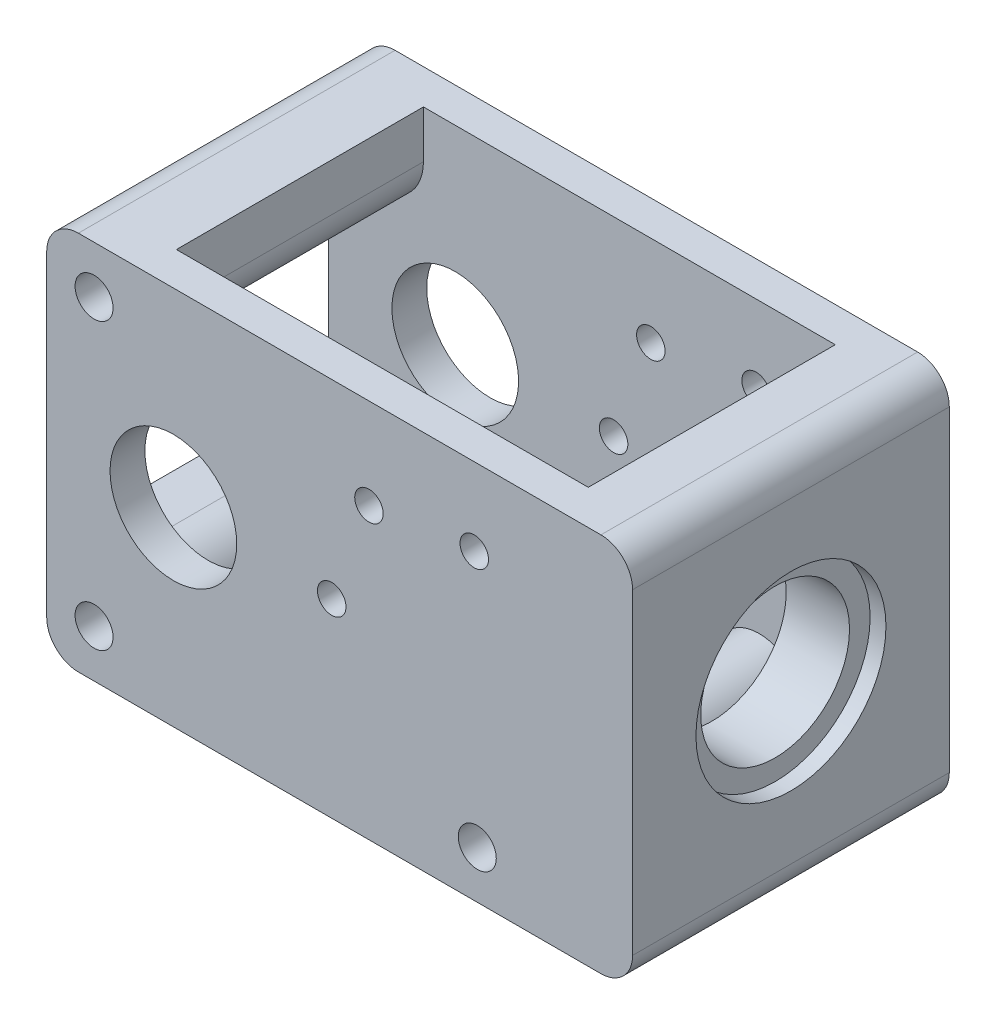
ISO-10303-21;
HEADER;
FILE_DESCRIPTION(('STEP AP214'),'2;1');
FILE_NAME('part.step','',(''),(''),'','','');
FILE_SCHEMA(('AUTOMOTIVE_DESIGN { 1 0 10303 214 1 1 1 1 }'));
ENDSEC;
DATA;
#1=APPLICATION_CONTEXT('core data for automotive mechanical design processes');
#2=APPLICATION_PROTOCOL_DEFINITION('international standard','automotive_design',2000,#1);
#3=PRODUCT_CONTEXT('',#1,'mechanical');
#4=PRODUCT('Part','Part','',(#3));
#5=PRODUCT_RELATED_PRODUCT_CATEGORY('part','',(#4));
#6=PRODUCT_DEFINITION_FORMATION('','',#4);
#7=PRODUCT_DEFINITION_CONTEXT('part definition',#1,'design');
#8=PRODUCT_DEFINITION('design','',#6,#7);
#9=PRODUCT_DEFINITION_SHAPE('','',#8);
#10=(LENGTH_UNIT() NAMED_UNIT(*) SI_UNIT(.MILLI.,.METRE.));
#11=(NAMED_UNIT(*) PLANE_ANGLE_UNIT() SI_UNIT($,.RADIAN.));
#12=(NAMED_UNIT(*) SI_UNIT($,.STERADIAN.) SOLID_ANGLE_UNIT());
#13=UNCERTAINTY_MEASURE_WITH_UNIT(LENGTH_MEASURE(1.E-05),#10,'distance_accuracy_value','');
#14=(GEOMETRIC_REPRESENTATION_CONTEXT(3) GLOBAL_UNCERTAINTY_ASSIGNED_CONTEXT((#13)) GLOBAL_UNIT_ASSIGNED_CONTEXT((#10,
#11,#12)) REPRESENTATION_CONTEXT('',''));
#15=CARTESIAN_POINT('',(0.,0.,0.));
#16=DIRECTION('',(0.,0.,1.));
#17=DIRECTION('',(1.,0.,0.));
#18=AXIS2_PLACEMENT_3D('',#15,#16,#17);
#19=CARTESIAN_POINT('',(-4.,0.,0.));
#20=DIRECTION('',(1.,0.,0.));
#21=DIRECTION('',(0.,0.,-1.));
#22=AXIS2_PLACEMENT_3D('',#19,#20,#21);
#23=CYLINDRICAL_SURFACE('',#22,2.35);
#24=CARTESIAN_POINT('',(12.,0.,0.));
#25=DIRECTION('',(1.,0.,0.));
#26=DIRECTION('',(0.,1.,0.));
#27=AXIS2_PLACEMENT_3D('',#24,#25,#26);
#28=CIRCLE('',#27,2.35);
#29=CARTESIAN_POINT('',(12.,2.35,0.));
#30=VERTEX_POINT('',#29);
#31=EDGE_CURVE('E315',#30,#30,#28,.T.);
#32=ORIENTED_EDGE('',*,*,#31,.F.);
#33=EDGE_LOOP('',(#32));
#34=FACE_BOUND('',#33,.T.);
#35=CARTESIAN_POINT('',(14.,0.,0.));
#36=DIRECTION('',(1.,0.,0.));
#37=DIRECTION('',(0.,0.,-1.));
#38=AXIS2_PLACEMENT_3D('',#35,#36,#37);
#39=CIRCLE('',#38,2.35);
#40=CARTESIAN_POINT('',(14.,0.,-2.35));
#41=VERTEX_POINT('',#40);
#42=EDGE_CURVE('E40',#41,#41,#39,.F.);
#43=ORIENTED_EDGE('',*,*,#42,.F.);
#44=EDGE_LOOP('',(#43));
#45=FACE_BOUND('',#44,.T.);
#46=ADVANCED_FACE('F36',(#34,#45),#23,.F.);
#47=CARTESIAN_POINT('',(0.,0.,5.));
#48=DIRECTION('',(0.,0.,-1.));
#49=DIRECTION('',(-1.,0.,0.));
#50=AXIS2_PLACEMENT_3D('',#47,#48,#49);
#51=CYLINDRICAL_SURFACE('',#50,2.);
#52=CARTESIAN_POINT('',(0.,0.,5.));
#53=DIRECTION('',(0.,0.,1.));
#54=DIRECTION('',(1.,0.,0.));
#55=AXIS2_PLACEMENT_3D('',#52,#53,#54);
#56=CIRCLE('',#55,2.);
#57=CARTESIAN_POINT('',(2.,0.,5.));
#58=VERTEX_POINT('',#57);
#59=EDGE_CURVE('E252',#58,#58,#56,.T.);
#60=ORIENTED_EDGE('',*,*,#59,.T.);
#61=EDGE_LOOP('',(#60));
#62=FACE_BOUND('',#61,.T.);
#63=CARTESIAN_POINT('',(0.,0.,3.9));
#64=DIRECTION('',(0.,0.,-1.));
#65=DIRECTION('',(-1.,0.,0.));
#66=AXIS2_PLACEMENT_3D('',#63,#64,#65);
#67=CIRCLE('',#66,2.);
#68=CARTESIAN_POINT('',(-2.,0.,3.9));
#69=VERTEX_POINT('',#68);
#70=EDGE_CURVE('E202',#69,#69,#67,.T.);
#71=ORIENTED_EDGE('',*,*,#70,.T.);
#72=EDGE_LOOP('',(#71));
#73=FACE_BOUND('',#72,.T.);
#74=ADVANCED_FACE('F433',(#62,#73),#51,.F.);
#75=CARTESIAN_POINT('',(5.,0.,5.));
#76=DIRECTION('',(0.,0.,-1.));
#77=DIRECTION('',(-1.,0.,0.));
#78=AXIS2_PLACEMENT_3D('',#75,#76,#77);
#79=CYLINDRICAL_SURFACE('',#78,0.450000000000002);
#80=CARTESIAN_POINT('',(5.,0.,5.));
#81=DIRECTION('',(0.,0.,1.));
#82=DIRECTION('',(1.,0.,0.));
#83=AXIS2_PLACEMENT_3D('',#80,#81,#82);
#84=CIRCLE('',#83,0.450000000000002);
#85=CARTESIAN_POINT('',(5.45,0.,5.));
#86=VERTEX_POINT('',#85);
#87=EDGE_CURVE('E246',#86,#86,#84,.T.);
#88=ORIENTED_EDGE('',*,*,#87,.T.);
#89=EDGE_LOOP('',(#88));
#90=FACE_BOUND('',#89,.T.);
#91=CARTESIAN_POINT('',(5.,0.,3.9));
#92=DIRECTION('',(0.,0.,-1.));
#93=DIRECTION('',(-1.,0.,0.));
#94=AXIS2_PLACEMENT_3D('',#91,#92,#93);
#95=CIRCLE('',#94,0.450000000000002);
#96=CARTESIAN_POINT('',(4.55,0.,3.9));
#97=VERTEX_POINT('',#96);
#98=EDGE_CURVE('E198',#97,#97,#95,.T.);
#99=ORIENTED_EDGE('',*,*,#98,.T.);
#100=EDGE_LOOP('',(#99));
#101=FACE_BOUND('',#100,.T.);
#102=ADVANCED_FACE('F439',(#90,#101),#79,.F.);
#103=CARTESIAN_POINT('',(9.5,3.55,5.));
#104=DIRECTION('',(0.,0.,-1.));
#105=DIRECTION('',(-1.,0.,0.));
#106=AXIS2_PLACEMENT_3D('',#103,#104,#105);
#107=CYLINDRICAL_SURFACE('',#106,0.449999999999997);
#108=CARTESIAN_POINT('',(9.5,3.55,5.));
#109=DIRECTION('',(0.,0.,1.));
#110=DIRECTION('',(1.,0.,0.));
#111=AXIS2_PLACEMENT_3D('',#108,#109,#110);
#112=CIRCLE('',#111,0.449999999999997);
#113=CARTESIAN_POINT('',(9.95,3.55,5.));
#114=VERTEX_POINT('',#113);
#115=EDGE_CURVE('E228',#114,#114,#112,.T.);
#116=ORIENTED_EDGE('',*,*,#115,.T.);
#117=EDGE_LOOP('',(#116));
#118=FACE_BOUND('',#117,.T.);
#119=CARTESIAN_POINT('',(9.5,3.55,3.9));
#120=DIRECTION('',(0.,0.,-1.));
#121=DIRECTION('',(-1.,0.,0.));
#122=AXIS2_PLACEMENT_3D('',#119,#120,#121);
#123=CIRCLE('',#122,0.449999999999997);
#124=CARTESIAN_POINT('',(9.05,3.55,3.9));
#125=VERTEX_POINT('',#124);
#126=EDGE_CURVE('E195',#125,#125,#123,.T.);
#127=ORIENTED_EDGE('',*,*,#126,.T.);
#128=EDGE_LOOP('',(#127));
#129=FACE_BOUND('',#128,.T.);
#130=ADVANCED_FACE('F473',(#118,#129),#107,.F.);
#131=CARTESIAN_POINT('',(6.17555968507525,3.13696659638348,5.));
#132=DIRECTION('',(0.,0.,-1.));
#133=DIRECTION('',(-1.,0.,0.));
#134=AXIS2_PLACEMENT_3D('',#131,#132,#133);
#135=CYLINDRICAL_SURFACE('',#134,0.45);
#136=CARTESIAN_POINT('',(6.17555968507525,3.13696659638348,5.));
#137=DIRECTION('',(0.,0.,1.));
#138=DIRECTION('',(1.,0.,0.));
#139=AXIS2_PLACEMENT_3D('',#136,#137,#138);
#140=CIRCLE('',#139,0.45);
#141=CARTESIAN_POINT('',(6.62555968507525,3.13696659638348,5.));
#142=VERTEX_POINT('',#141);
#143=EDGE_CURVE('E222',#142,#142,#140,.T.);
#144=ORIENTED_EDGE('',*,*,#143,.T.);
#145=EDGE_LOOP('',(#144));
#146=FACE_BOUND('',#145,.T.);
#147=CARTESIAN_POINT('',(6.17555968507525,3.13696659638348,3.9));
#148=DIRECTION('',(0.,0.,-1.));
#149=DIRECTION('',(-1.,0.,0.));
#150=AXIS2_PLACEMENT_3D('',#147,#148,#149);
#151=CIRCLE('',#150,0.45);
#152=CARTESIAN_POINT('',(5.72555968507525,3.13696659638348,3.9));
#153=VERTEX_POINT('',#152);
#154=EDGE_CURVE('E199',#153,#153,#151,.T.);
#155=ORIENTED_EDGE('',*,*,#154,.T.);
#156=EDGE_LOOP('',(#155));
#157=FACE_BOUND('',#156,.T.);
#158=ADVANCED_FACE('F470',(#146,#157),#135,.F.);
#159=CARTESIAN_POINT('',(13.5,5.,5.));
#160=DIRECTION('',(0.,0.,-1.));
#161=DIRECTION('',(-1.,0.,0.));
#162=AXIS2_PLACEMENT_3D('',#159,#160,#161);
#163=PLANE('',#162);
#164=CARTESIAN_POINT('',(13.5,5.,5.));
#165=DIRECTION('',(0.,0.,1.));
#166=DIRECTION('',(-1.,0.,0.));
#167=AXIS2_PLACEMENT_3D('',#164,#165,#166);
#168=CIRCLE('',#167,1.);
#169=CARTESIAN_POINT('',(14.5,4.99999999999999,5.));
#170=VERTEX_POINT('',#169);
#171=CARTESIAN_POINT('',(13.5,6.,5.));
#172=VERTEX_POINT('',#171);
#173=EDGE_CURVE('E258',#170,#172,#168,.T.);
#174=ORIENTED_EDGE('',*,*,#173,.T.);
#175=DIRECTION('',(-1.,0.,0.));
#176=VECTOR('',#175,1.);
#177=CARTESIAN_POINT('',(-2.99999999999999,6.,5.));
#178=LINE('',#177,#176);
#179=CARTESIAN_POINT('',(-2.99999999999999,6.,5.));
#180=VERTEX_POINT('',#179);
#181=EDGE_CURVE('E261',#172,#180,#178,.T.);
#182=ORIENTED_EDGE('',*,*,#181,.T.);
#183=CARTESIAN_POINT('',(-3.,5.,5.));
#184=DIRECTION('',(0.,0.,1.));
#185=DIRECTION('',(1.,0.,0.));
#186=AXIS2_PLACEMENT_3D('',#183,#184,#185);
#187=CIRCLE('',#186,1.);
#188=CARTESIAN_POINT('',(-4.,4.99999999999999,5.));
#189=VERTEX_POINT('',#188);
#190=EDGE_CURVE('E264',#180,#189,#187,.T.);
#191=ORIENTED_EDGE('',*,*,#190,.T.);
#192=DIRECTION('',(0.,-1.,0.));
#193=VECTOR('',#192,1.);
#194=CARTESIAN_POINT('',(-4.,4.99999999999999,5.));
#195=LINE('',#194,#193);
#196=CARTESIAN_POINT('',(-4.,-4.99999999999999,5.));
#197=VERTEX_POINT('',#196);
#198=EDGE_CURVE('E266',#189,#197,#195,.T.);
#199=ORIENTED_EDGE('',*,*,#198,.T.);
#200=CARTESIAN_POINT('',(-3.,-5.,5.));
#201=DIRECTION('',(0.,0.,1.));
#202=DIRECTION('',(1.,0.,0.));
#203=AXIS2_PLACEMENT_3D('',#200,#201,#202);
#204=CIRCLE('',#203,1.);
#205=CARTESIAN_POINT('',(-2.99999999999999,-6.,5.));
#206=VERTEX_POINT('',#205);
#207=EDGE_CURVE('E268',#197,#206,#204,.T.);
#208=ORIENTED_EDGE('',*,*,#207,.T.);
#209=DIRECTION('',(1.,0.,0.));
#210=VECTOR('',#209,1.);
#211=CARTESIAN_POINT('',(-2.99999999999999,-6.,5.));
#212=LINE('',#211,#210);
#213=CARTESIAN_POINT('',(13.5,-6.,5.));
#214=VERTEX_POINT('',#213);
#215=EDGE_CURVE('E270',#206,#214,#212,.T.);
#216=ORIENTED_EDGE('',*,*,#215,.T.);
#217=CARTESIAN_POINT('',(13.5,-5.,5.));
#218=DIRECTION('',(0.,0.,1.));
#219=DIRECTION('',(1.,0.,0.));
#220=AXIS2_PLACEMENT_3D('',#217,#218,#219);
#221=CIRCLE('',#220,1.);
#222=CARTESIAN_POINT('',(14.5,-5.,5.));
#223=VERTEX_POINT('',#222);
#224=EDGE_CURVE('E272',#214,#223,#221,.T.);
#225=ORIENTED_EDGE('',*,*,#224,.T.);
#226=DIRECTION('',(0.,1.,0.));
#227=VECTOR('',#226,1.);
#228=CARTESIAN_POINT('',(14.5,4.99999999999999,5.));
#229=LINE('',#228,#227);
#230=EDGE_CURVE('E274',#223,#170,#229,.T.);
#231=ORIENTED_EDGE('',*,*,#230,.T.);
#232=EDGE_LOOP('',(#174,#182,#191,#199,#208,#216,#225,#231));
#233=FACE_BOUND('',#232,.T.);
#234=ORIENTED_EDGE('',*,*,#59,.F.);
#235=EDGE_LOOP('',(#234));
#236=FACE_BOUND('',#235,.T.);
#237=ORIENTED_EDGE('',*,*,#87,.F.);
#238=EDGE_LOOP('',(#237));
#239=FACE_BOUND('',#238,.T.);
#240=CARTESIAN_POINT('',(-2.50449595727364,4.5,5.));
#241=DIRECTION('',(0.,0.,1.));
#242=DIRECTION('',(1.,0.,0.));
#243=AXIS2_PLACEMENT_3D('',#240,#241,#242);
#244=CIRCLE('',#243,0.6);
#245=CARTESIAN_POINT('',(-1.90449595727364,4.5,5.));
#246=VERTEX_POINT('',#245);
#247=EDGE_CURVE('E240',#246,#246,#244,.T.);
#248=ORIENTED_EDGE('',*,*,#247,.F.);
#249=EDGE_LOOP('',(#248));
#250=FACE_BOUND('',#249,.T.);
#251=CARTESIAN_POINT('',(-2.50449595727364,-4.5,5.));
#252=DIRECTION('',(0.,0.,1.));
#253=DIRECTION('',(1.,0.,0.));
#254=AXIS2_PLACEMENT_3D('',#251,#252,#253);
#255=CIRCLE('',#254,0.6);
#256=CARTESIAN_POINT('',(-1.90449595727364,-4.5,5.));
#257=VERTEX_POINT('',#256);
#258=EDGE_CURVE('E234',#257,#257,#255,.T.);
#259=ORIENTED_EDGE('',*,*,#258,.F.);
#260=EDGE_LOOP('',(#259));
#261=FACE_BOUND('',#260,.T.);
#262=ORIENTED_EDGE('',*,*,#115,.F.);
#263=EDGE_LOOP('',(#262));
#264=FACE_BOUND('',#263,.T.);
#265=ORIENTED_EDGE('',*,*,#143,.F.);
#266=EDGE_LOOP('',(#265));
#267=FACE_BOUND('',#266,.T.);
#268=CARTESIAN_POINT('',(9.59550404272636,-4.5,5.));
#269=DIRECTION('',(0.,0.,1.));
#270=DIRECTION('',(1.,0.,0.));
#271=AXIS2_PLACEMENT_3D('',#268,#269,#270);
#272=CIRCLE('',#271,0.6);
#273=CARTESIAN_POINT('',(10.1955040427264,-4.5,5.));
#274=VERTEX_POINT('',#273);
#275=EDGE_CURVE('E216',#274,#274,#272,.T.);
#276=ORIENTED_EDGE('',*,*,#275,.F.);
#277=EDGE_LOOP('',(#276));
#278=FACE_BOUND('',#277,.T.);
#279=ADVANCED_FACE('F472',(#233,#236,#239,#250,#261,#264,#267,#278),#163,.F.);
#280=CARTESIAN_POINT('',(13.5,5.,-5.));
#281=DIRECTION('',(0.,0.,-1.));
#282=DIRECTION('',(-1.,0.,0.));
#283=AXIS2_PLACEMENT_3D('',#280,#281,#282);
#284=PLANE('',#283);
#285=CARTESIAN_POINT('',(6.17555968507525,3.13696659638348,-5.));
#286=DIRECTION('',(0.,0.,1.));
#287=DIRECTION('',(1.,0.,0.));
#288=AXIS2_PLACEMENT_3D('',#285,#286,#287);
#289=CIRCLE('',#288,0.45);
#290=CARTESIAN_POINT('',(6.62555968507525,3.13696659638348,-5.));
#291=VERTEX_POINT('',#290);
#292=EDGE_CURVE('E219',#291,#291,#289,.T.);
#293=ORIENTED_EDGE('',*,*,#292,.T.);
#294=EDGE_LOOP('',(#293));
#295=FACE_BOUND('',#294,.T.);
#296=CARTESIAN_POINT('',(-2.50449595727364,-4.5,-5.));
#297=DIRECTION('',(0.,0.,1.));
#298=DIRECTION('',(1.,0.,0.));
#299=AXIS2_PLACEMENT_3D('',#296,#297,#298);
#300=CIRCLE('',#299,0.6);
#301=CARTESIAN_POINT('',(-1.90449595727364,-4.5,-5.));
#302=VERTEX_POINT('',#301);
#303=EDGE_CURVE('E231',#302,#302,#300,.T.);
#304=ORIENTED_EDGE('',*,*,#303,.T.);
#305=EDGE_LOOP('',(#304));
#306=FACE_BOUND('',#305,.T.);
#307=CARTESIAN_POINT('',(5.,0.,-5.));
#308=DIRECTION('',(0.,0.,1.));
#309=DIRECTION('',(1.,0.,0.));
#310=AXIS2_PLACEMENT_3D('',#307,#308,#309);
#311=CIRCLE('',#310,0.450000000000002);
#312=CARTESIAN_POINT('',(5.45,0.,-5.));
#313=VERTEX_POINT('',#312);
#314=EDGE_CURVE('E243',#313,#313,#311,.T.);
#315=ORIENTED_EDGE('',*,*,#314,.T.);
#316=EDGE_LOOP('',(#315));
#317=FACE_BOUND('',#316,.T.);
#318=CARTESIAN_POINT('',(13.5,5.,-5.));
#319=DIRECTION('',(0.,0.,1.));
#320=DIRECTION('',(-1.,0.,0.));
#321=AXIS2_PLACEMENT_3D('',#318,#319,#320);
#322=CIRCLE('',#321,1.);
#323=CARTESIAN_POINT('',(14.5,4.99999999999999,-5.));
#324=VERTEX_POINT('',#323);
#325=CARTESIAN_POINT('',(13.5,6.,-5.));
#326=VERTEX_POINT('',#325);
#327=EDGE_CURVE('E255',#324,#326,#322,.T.);
#328=ORIENTED_EDGE('',*,*,#327,.F.);
#329=DIRECTION('',(0.,1.,0.));
#330=VECTOR('',#329,1.);
#331=CARTESIAN_POINT('',(14.5,4.99999999999999,-5.));
#332=LINE('',#331,#330);
#333=CARTESIAN_POINT('',(14.5,-5.,-5.));
#334=VERTEX_POINT('',#333);
#335=EDGE_CURVE('E262',#334,#324,#332,.T.);
#336=ORIENTED_EDGE('',*,*,#335,.F.);
#337=CARTESIAN_POINT('',(13.5,-5.,-5.));
#338=DIRECTION('',(0.,0.,1.));
#339=DIRECTION('',(1.,0.,0.));
#340=AXIS2_PLACEMENT_3D('',#337,#338,#339);
#341=CIRCLE('',#340,1.);
#342=CARTESIAN_POINT('',(13.5,-6.,-5.));
#343=VERTEX_POINT('',#342);
#344=EDGE_CURVE('E289',#343,#334,#341,.T.);
#345=ORIENTED_EDGE('',*,*,#344,.F.);
#346=DIRECTION('',(1.,0.,0.));
#347=VECTOR('',#346,1.);
#348=CARTESIAN_POINT('',(-2.99999999999999,-6.,-5.));
#349=LINE('',#348,#347);
#350=CARTESIAN_POINT('',(-2.99999999999999,-6.,-5.));
#351=VERTEX_POINT('',#350);
#352=EDGE_CURVE('E287',#351,#343,#349,.T.);
#353=ORIENTED_EDGE('',*,*,#352,.F.);
#354=CARTESIAN_POINT('',(-3.,-5.,-5.));
#355=DIRECTION('',(0.,0.,1.));
#356=DIRECTION('',(1.,0.,0.));
#357=AXIS2_PLACEMENT_3D('',#354,#355,#356);
#358=CIRCLE('',#357,1.);
#359=CARTESIAN_POINT('',(-4.,-4.99999999999999,-5.));
#360=VERTEX_POINT('',#359);
#361=EDGE_CURVE('E285',#360,#351,#358,.T.);
#362=ORIENTED_EDGE('',*,*,#361,.F.);
#363=DIRECTION('',(0.,-1.,0.));
#364=VECTOR('',#363,1.);
#365=CARTESIAN_POINT('',(-4.,4.99999999999999,-5.));
#366=LINE('',#365,#364);
#367=CARTESIAN_POINT('',(-4.,4.99999999999999,-5.));
#368=VERTEX_POINT('',#367);
#369=EDGE_CURVE('E283',#368,#360,#366,.T.);
#370=ORIENTED_EDGE('',*,*,#369,.F.);
#371=CARTESIAN_POINT('',(-3.,5.,-5.));
#372=DIRECTION('',(0.,0.,1.));
#373=DIRECTION('',(1.,0.,0.));
#374=AXIS2_PLACEMENT_3D('',#371,#372,#373);
#375=CIRCLE('',#374,1.);
#376=CARTESIAN_POINT('',(-2.99999999999999,6.,-5.));
#377=VERTEX_POINT('',#376);
#378=EDGE_CURVE('E281',#377,#368,#375,.T.);
#379=ORIENTED_EDGE('',*,*,#378,.F.);
#380=DIRECTION('',(-1.,0.,0.));
#381=VECTOR('',#380,1.);
#382=CARTESIAN_POINT('',(-2.99999999999999,6.,-5.));
#383=LINE('',#382,#381);
#384=EDGE_CURVE('E279',#326,#377,#383,.T.);
#385=ORIENTED_EDGE('',*,*,#384,.F.);
#386=EDGE_LOOP('',(#328,#336,#345,#353,#362,#370,#379,#385));
#387=FACE_BOUND('',#386,.T.);
#388=CARTESIAN_POINT('',(0.,0.,-5.));
#389=DIRECTION('',(0.,0.,1.));
#390=DIRECTION('',(1.,0.,0.));
#391=AXIS2_PLACEMENT_3D('',#388,#389,#390);
#392=CIRCLE('',#391,2.);
#393=CARTESIAN_POINT('',(2.,0.,-5.));
#394=VERTEX_POINT('',#393);
#395=EDGE_CURVE('E249',#394,#394,#392,.T.);
#396=ORIENTED_EDGE('',*,*,#395,.T.);
#397=EDGE_LOOP('',(#396));
#398=FACE_BOUND('',#397,.T.);
#399=CARTESIAN_POINT('',(-2.50449595727364,4.5,-5.));
#400=DIRECTION('',(0.,0.,1.));
#401=DIRECTION('',(1.,0.,0.));
#402=AXIS2_PLACEMENT_3D('',#399,#400,#401);
#403=CIRCLE('',#402,0.6);
#404=CARTESIAN_POINT('',(-1.90449595727364,4.5,-5.));
#405=VERTEX_POINT('',#404);
#406=EDGE_CURVE('E237',#405,#405,#403,.T.);
#407=ORIENTED_EDGE('',*,*,#406,.T.);
#408=EDGE_LOOP('',(#407));
#409=FACE_BOUND('',#408,.T.);
#410=CARTESIAN_POINT('',(9.5,3.55,-5.));
#411=DIRECTION('',(0.,0.,1.));
#412=DIRECTION('',(1.,0.,0.));
#413=AXIS2_PLACEMENT_3D('',#410,#411,#412);
#414=CIRCLE('',#413,0.449999999999997);
#415=CARTESIAN_POINT('',(9.95,3.55,-5.));
#416=VERTEX_POINT('',#415);
#417=EDGE_CURVE('E225',#416,#416,#414,.T.);
#418=ORIENTED_EDGE('',*,*,#417,.T.);
#419=EDGE_LOOP('',(#418));
#420=FACE_BOUND('',#419,.T.);
#421=CARTESIAN_POINT('',(9.59550404272636,-4.5,-5.));
#422=DIRECTION('',(0.,0.,1.));
#423=DIRECTION('',(1.,0.,0.));
#424=AXIS2_PLACEMENT_3D('',#421,#422,#423);
#425=CIRCLE('',#424,0.6);
#426=CARTESIAN_POINT('',(10.1955040427264,-4.5,-5.));
#427=VERTEX_POINT('',#426);
#428=EDGE_CURVE('E215',#427,#427,#425,.T.);
#429=ORIENTED_EDGE('',*,*,#428,.T.);
#430=EDGE_LOOP('',(#429));
#431=FACE_BOUND('',#430,.T.);
#432=ADVANCED_FACE('F480',(#295,#306,#317,#387,#398,#409,#420,#431),#284,.T.);
#433=CARTESIAN_POINT('',(13.5,5.,5.));
#434=DIRECTION('',(0.,0.,-1.));
#435=DIRECTION('',(-1.,0.,0.));
#436=AXIS2_PLACEMENT_3D('',#433,#434,#435);
#437=CYLINDRICAL_SURFACE('',#436,1.);
#438=ORIENTED_EDGE('',*,*,#327,.T.);
#439=DIRECTION('',(0.,0.,-1.));
#440=VECTOR('',#439,1.);
#441=CARTESIAN_POINT('',(13.5,6.,5.));
#442=LINE('',#441,#440);
#443=EDGE_CURVE('E11',#172,#326,#442,.T.);
#444=ORIENTED_EDGE('',*,*,#443,.F.);
#445=ORIENTED_EDGE('',*,*,#173,.F.);
#446=DIRECTION('',(0.,0.,-1.));
#447=VECTOR('',#446,1.);
#448=CARTESIAN_POINT('',(14.5,4.99999999999999,5.));
#449=LINE('',#448,#447);
#450=EDGE_CURVE('E276',#170,#324,#449,.T.);
#451=ORIENTED_EDGE('',*,*,#450,.T.);
#452=EDGE_LOOP('',(#438,#444,#445,#451));
#453=FACE_BOUND('',#452,.T.);
#454=ADVANCED_FACE('F38',(#453),#437,.T.);
#455=CARTESIAN_POINT('',(-2.99999999999999,6.,5.));
#456=DIRECTION('',(0.,-1.,0.));
#457=DIRECTION('',(0.,0.,-1.));
#458=AXIS2_PLACEMENT_3D('',#455,#456,#457);
#459=PLANE('',#458);
#460=DIRECTION('',(0.,0.,1.));
#461=VECTOR('',#460,1.);
#462=CARTESIAN_POINT('',(-1.00449595727364,6.,-3.9));
#463=LINE('',#462,#461);
#464=CARTESIAN_POINT('',(-1.00449595727364,6.,-3.9));
#465=VERTEX_POINT('',#464);
#466=CARTESIAN_POINT('',(-1.00449595727364,6.,3.9));
#467=VERTEX_POINT('',#466);
#468=EDGE_CURVE('E167',#465,#467,#463,.T.);
#469=ORIENTED_EDGE('',*,*,#468,.F.);
#470=DIRECTION('',(-1.,0.,0.));
#471=VECTOR('',#470,1.);
#472=CARTESIAN_POINT('',(12.,6.,-3.9));
#473=LINE('',#472,#471);
#474=CARTESIAN_POINT('',(12.,6.,-3.9));
#475=VERTEX_POINT('',#474);
#476=EDGE_CURVE('E174',#475,#465,#473,.T.);
#477=ORIENTED_EDGE('',*,*,#476,.F.);
#478=DIRECTION('',(0.,0.,1.));
#479=VECTOR('',#478,1.);
#480=CARTESIAN_POINT('',(12.,6.,-3.9));
#481=LINE('',#480,#479);
#482=CARTESIAN_POINT('',(12.,6.,3.9));
#483=VERTEX_POINT('',#482);
#484=EDGE_CURVE('E313',#475,#483,#481,.T.);
#485=ORIENTED_EDGE('',*,*,#484,.T.);
#486=DIRECTION('',(-1.,0.,0.));
#487=VECTOR('',#486,1.);
#488=CARTESIAN_POINT('',(12.,6.,3.9));
#489=LINE('',#488,#487);
#490=EDGE_CURVE('E187',#483,#467,#489,.T.);
#491=ORIENTED_EDGE('',*,*,#490,.T.);
#492=EDGE_LOOP('',(#469,#477,#485,#491));
#493=FACE_BOUND('',#492,.T.);
#494=ORIENTED_EDGE('',*,*,#384,.T.);
#495=DIRECTION('',(0.,0.,-1.));
#496=VECTOR('',#495,1.);
#497=CARTESIAN_POINT('',(-2.99999999999999,6.,5.));
#498=LINE('',#497,#496);
#499=EDGE_CURVE('E45',#180,#377,#498,.T.);
#500=ORIENTED_EDGE('',*,*,#499,.F.);
#501=ORIENTED_EDGE('',*,*,#181,.F.);
#502=ORIENTED_EDGE('',*,*,#443,.T.);
#503=EDGE_LOOP('',(#494,#500,#501,#502));
#504=FACE_BOUND('',#503,.T.);
#505=ADVANCED_FACE('F185',(#493,#504),#459,.F.);
#506=CARTESIAN_POINT('',(-3.,5.,5.));
#507=DIRECTION('',(0.,0.,-1.));
#508=DIRECTION('',(-1.,0.,0.));
#509=AXIS2_PLACEMENT_3D('',#506,#507,#508);
#510=CYLINDRICAL_SURFACE('',#509,1.);
#511=ORIENTED_EDGE('',*,*,#378,.T.);
#512=DIRECTION('',(0.,0.,-1.));
#513=VECTOR('',#512,1.);
#514=CARTESIAN_POINT('',(-4.,4.99999999999999,5.));
#515=LINE('',#514,#513);
#516=EDGE_CURVE('E306',#189,#368,#515,.T.);
#517=ORIENTED_EDGE('',*,*,#516,.F.);
#518=ORIENTED_EDGE('',*,*,#190,.F.);
#519=ORIENTED_EDGE('',*,*,#499,.T.);
#520=EDGE_LOOP('',(#511,#517,#518,#519));
#521=FACE_BOUND('',#520,.T.);
#522=ADVANCED_FACE('F549',(#521),#510,.T.);
#523=CARTESIAN_POINT('',(-4.,4.99999999999999,5.));
#524=DIRECTION('',(1.,0.,0.));
#525=DIRECTION('',(0.,0.,-1.));
#526=AXIS2_PLACEMENT_3D('',#523,#524,#525);
#527=PLANE('',#526);
#528=DIRECTION('',(0.,0.,1.));
#529=VECTOR('',#528,1.);
#530=CARTESIAN_POINT('',(-4.,-3.,-3.9));
#531=LINE('',#530,#529);
#532=CARTESIAN_POINT('',(-4.,-3.,-3.9));
#533=VERTEX_POINT('',#532);
#534=CARTESIAN_POINT('',(-4.,-3.,3.9));
#535=VERTEX_POINT('',#534);
#536=EDGE_CURVE('E388',#533,#535,#531,.T.);
#537=ORIENTED_EDGE('',*,*,#536,.F.);
#538=DIRECTION('',(0.,-1.,0.));
#539=VECTOR('',#538,1.);
#540=CARTESIAN_POINT('',(-4.,-3.,-3.9));
#541=LINE('',#540,#539);
#542=CARTESIAN_POINT('',(-4.,3.,-3.9));
#543=VERTEX_POINT('',#542);
#544=EDGE_CURVE('E341',#543,#533,#541,.T.);
#545=ORIENTED_EDGE('',*,*,#544,.F.);
#546=DIRECTION('',(0.,0.,1.));
#547=VECTOR('',#546,1.);
#548=CARTESIAN_POINT('',(-4.,3.,-3.9));
#549=LINE('',#548,#547);
#550=CARTESIAN_POINT('',(-4.,3.,3.9));
#551=VERTEX_POINT('',#550);
#552=EDGE_CURVE('E390',#543,#551,#549,.T.);
#553=ORIENTED_EDGE('',*,*,#552,.T.);
#554=DIRECTION('',(0.,-1.,0.));
#555=VECTOR('',#554,1.);
#556=CARTESIAN_POINT('',(-4.,-3.,3.9));
#557=LINE('',#556,#555);
#558=EDGE_CURVE('E362',#551,#535,#557,.T.);
#559=ORIENTED_EDGE('',*,*,#558,.T.);
#560=EDGE_LOOP('',(#537,#545,#553,#559));
#561=FACE_BOUND('',#560,.T.);
#562=ORIENTED_EDGE('',*,*,#369,.T.);
#563=DIRECTION('',(0.,0.,-1.));
#564=VECTOR('',#563,1.);
#565=CARTESIAN_POINT('',(-4.,-4.99999999999999,5.));
#566=LINE('',#565,#564);
#567=EDGE_CURVE('E303',#197,#360,#566,.T.);
#568=ORIENTED_EDGE('',*,*,#567,.F.);
#569=ORIENTED_EDGE('',*,*,#198,.F.);
#570=ORIENTED_EDGE('',*,*,#516,.T.);
#571=EDGE_LOOP('',(#562,#568,#569,#570));
#572=FACE_BOUND('',#571,.T.);
#573=ADVANCED_FACE('F402',(#561,#572),#527,.F.);
#574=CARTESIAN_POINT('',(-3.,-5.,5.));
#575=DIRECTION('',(0.,0.,-1.));
#576=DIRECTION('',(-1.,0.,0.));
#577=AXIS2_PLACEMENT_3D('',#574,#575,#576);
#578=CYLINDRICAL_SURFACE('',#577,1.);
#579=ORIENTED_EDGE('',*,*,#361,.T.);
#580=DIRECTION('',(0.,0.,-1.));
#581=VECTOR('',#580,1.);
#582=CARTESIAN_POINT('',(-2.99999999999999,-6.,5.));
#583=LINE('',#582,#581);
#584=EDGE_CURVE('E300',#206,#351,#583,.T.);
#585=ORIENTED_EDGE('',*,*,#584,.F.);
#586=ORIENTED_EDGE('',*,*,#207,.F.);
#587=ORIENTED_EDGE('',*,*,#567,.T.);
#588=EDGE_LOOP('',(#579,#585,#586,#587));
#589=FACE_BOUND('',#588,.T.);
#590=ADVANCED_FACE('F543',(#589),#578,.T.);
#591=CARTESIAN_POINT('',(-2.99999999999999,-6.,5.));
#592=DIRECTION('',(0.,1.,0.));
#593=DIRECTION('',(0.,0.,1.));
#594=AXIS2_PLACEMENT_3D('',#591,#592,#593);
#595=PLANE('',#594);
#596=DIRECTION('',(0.,0.,1.));
#597=VECTOR('',#596,1.);
#598=CARTESIAN_POINT('',(12.,-6.,-3.9));
#599=LINE('',#598,#597);
#600=CARTESIAN_POINT('',(12.,-6.,-3.9));
#601=VERTEX_POINT('',#600);
#602=CARTESIAN_POINT('',(12.,-6.,3.9));
#603=VERTEX_POINT('',#602);
#604=EDGE_CURVE('E378',#601,#603,#599,.T.);
#605=ORIENTED_EDGE('',*,*,#604,.F.);
#606=DIRECTION('',(1.,0.,0.));
#607=VECTOR('',#606,1.);
#608=CARTESIAN_POINT('',(12.,-6.,-3.9));
#609=LINE('',#608,#607);
#610=CARTESIAN_POINT('',(-1.00449595727364,-6.,-3.9));
#611=VERTEX_POINT('',#610);
#612=EDGE_CURVE('E191',#611,#601,#609,.T.);
#613=ORIENTED_EDGE('',*,*,#612,.F.);
#614=DIRECTION('',(0.,0.,1.));
#615=VECTOR('',#614,1.);
#616=CARTESIAN_POINT('',(-1.00449595727364,-6.,-3.9));
#617=LINE('',#616,#615);
#618=CARTESIAN_POINT('',(-1.00449595727364,-6.,3.9));
#619=VERTEX_POINT('',#618);
#620=EDGE_CURVE('E381',#611,#619,#617,.T.);
#621=ORIENTED_EDGE('',*,*,#620,.T.);
#622=DIRECTION('',(1.,0.,0.));
#623=VECTOR('',#622,1.);
#624=CARTESIAN_POINT('',(12.,-6.,3.9));
#625=LINE('',#624,#623);
#626=EDGE_CURVE('E372',#619,#603,#625,.T.);
#627=ORIENTED_EDGE('',*,*,#626,.T.);
#628=EDGE_LOOP('',(#605,#613,#621,#627));
#629=FACE_BOUND('',#628,.T.);
#630=ORIENTED_EDGE('',*,*,#352,.T.);
#631=DIRECTION('',(0.,0.,-1.));
#632=VECTOR('',#631,1.);
#633=CARTESIAN_POINT('',(13.5,-6.,5.));
#634=LINE('',#633,#632);
#635=EDGE_CURVE('E297',#214,#343,#634,.T.);
#636=ORIENTED_EDGE('',*,*,#635,.F.);
#637=ORIENTED_EDGE('',*,*,#215,.F.);
#638=ORIENTED_EDGE('',*,*,#584,.T.);
#639=EDGE_LOOP('',(#630,#636,#637,#638));
#640=FACE_BOUND('',#639,.T.);
#641=ADVANCED_FACE('F416',(#629,#640),#595,.F.);
#642=CARTESIAN_POINT('',(13.5,-5.,5.));
#643=DIRECTION('',(0.,0.,-1.));
#644=DIRECTION('',(-1.,0.,0.));
#645=AXIS2_PLACEMENT_3D('',#642,#643,#644);
#646=CYLINDRICAL_SURFACE('',#645,1.);
#647=ORIENTED_EDGE('',*,*,#344,.T.);
#648=DIRECTION('',(0.,0.,-1.));
#649=VECTOR('',#648,1.);
#650=CARTESIAN_POINT('',(14.5,-5.,5.));
#651=LINE('',#650,#649);
#652=EDGE_CURVE('E294',#223,#334,#651,.T.);
#653=ORIENTED_EDGE('',*,*,#652,.F.);
#654=ORIENTED_EDGE('',*,*,#224,.F.);
#655=ORIENTED_EDGE('',*,*,#635,.T.);
#656=EDGE_LOOP('',(#647,#653,#654,#655));
#657=FACE_BOUND('',#656,.T.);
#658=ADVANCED_FACE('F536',(#657),#646,.T.);
#659=CARTESIAN_POINT('',(14.5,4.99999999999999,5.));
#660=DIRECTION('',(-1.,0.,0.));
#661=DIRECTION('',(0.,0.,1.));
#662=AXIS2_PLACEMENT_3D('',#659,#660,#661);
#663=PLANE('',#662);
#664=CARTESIAN_POINT('',(14.5,0.,0.));
#665=DIRECTION('',(1.,0.,0.));
#666=DIRECTION('',(0.,0.,-1.));
#667=AXIS2_PLACEMENT_3D('',#664,#665,#666);
#668=CIRCLE('',#667,3.);
#669=CARTESIAN_POINT('',(14.5,0.,-3.));
#670=VERTEX_POINT('',#669);
#671=EDGE_CURVE('E328',#670,#670,#668,.T.);
#672=ORIENTED_EDGE('',*,*,#671,.F.);
#673=EDGE_LOOP('',(#672));
#674=FACE_BOUND('',#673,.T.);
#675=ORIENTED_EDGE('',*,*,#335,.T.);
#676=ORIENTED_EDGE('',*,*,#450,.F.);
#677=ORIENTED_EDGE('',*,*,#230,.F.);
#678=ORIENTED_EDGE('',*,*,#652,.T.);
#679=EDGE_LOOP('',(#675,#676,#677,#678));
#680=FACE_BOUND('',#679,.T.);
#681=ADVANCED_FACE('F531',(#674,#680),#663,.F.);
#682=CARTESIAN_POINT('',(0.,0.,-3.9));
#683=DIRECTION('',(0.,0.,-1.));
#684=DIRECTION('',(-1.,0.,0.));
#685=AXIS2_PLACEMENT_3D('',#682,#683,#684);
#686=CIRCLE('',#685,2.);
#687=CARTESIAN_POINT('',(-2.,0.,-3.9));
#688=VERTEX_POINT('',#687);
#689=EDGE_CURVE('E212',#688,#688,#686,.T.);
#690=ORIENTED_EDGE('',*,*,#689,.F.);
#691=EDGE_LOOP('',(#690));
#692=FACE_BOUND('',#691,.T.);
#693=ORIENTED_EDGE('',*,*,#395,.F.);
#694=EDGE_LOOP('',(#693));
#695=FACE_BOUND('',#694,.T.);
#696=ADVANCED_FACE('F442',(#692,#695),#51,.F.);
#697=CARTESIAN_POINT('',(5.,0.,-3.9));
#698=DIRECTION('',(0.,0.,-1.));
#699=DIRECTION('',(-1.,0.,0.));
#700=AXIS2_PLACEMENT_3D('',#697,#698,#699);
#701=CIRCLE('',#700,0.450000000000002);
#702=CARTESIAN_POINT('',(4.55,0.,-3.9));
#703=VERTEX_POINT('',#702);
#704=EDGE_CURVE('E209',#703,#703,#701,.T.);
#705=ORIENTED_EDGE('',*,*,#704,.F.);
#706=EDGE_LOOP('',(#705));
#707=FACE_BOUND('',#706,.T.);
#708=ORIENTED_EDGE('',*,*,#314,.F.);
#709=EDGE_LOOP('',(#708));
#710=FACE_BOUND('',#709,.T.);
#711=ADVANCED_FACE('F519',(#707,#710),#79,.F.);
#712=CARTESIAN_POINT('',(-2.50449595727364,4.5,5.));
#713=DIRECTION('',(0.,0.,-1.));
#714=DIRECTION('',(-1.,0.,0.));
#715=AXIS2_PLACEMENT_3D('',#712,#713,#714);
#716=CYLINDRICAL_SURFACE('',#715,0.6);
#717=ORIENTED_EDGE('',*,*,#247,.T.);
#718=EDGE_LOOP('',(#717));
#719=FACE_BOUND('',#718,.T.);
#720=ORIENTED_EDGE('',*,*,#406,.F.);
#721=EDGE_LOOP('',(#720));
#722=FACE_BOUND('',#721,.T.);
#723=ADVANCED_FACE('F517',(#719,#722),#716,.F.);
#724=CARTESIAN_POINT('',(-2.50449595727364,-4.5,5.));
#725=DIRECTION('',(0.,0.,-1.));
#726=DIRECTION('',(-1.,0.,0.));
#727=AXIS2_PLACEMENT_3D('',#724,#725,#726);
#728=CYLINDRICAL_SURFACE('',#727,0.6);
#729=ORIENTED_EDGE('',*,*,#258,.T.);
#730=EDGE_LOOP('',(#729));
#731=FACE_BOUND('',#730,.T.);
#732=ORIENTED_EDGE('',*,*,#303,.F.);
#733=EDGE_LOOP('',(#732));
#734=FACE_BOUND('',#733,.T.);
#735=ADVANCED_FACE('F491',(#731,#734),#728,.F.);
#736=CARTESIAN_POINT('',(9.5,3.55,-3.9));
#737=DIRECTION('',(0.,0.,-1.));
#738=DIRECTION('',(-1.,0.,0.));
#739=AXIS2_PLACEMENT_3D('',#736,#737,#738);
#740=CIRCLE('',#739,0.449999999999997);
#741=CARTESIAN_POINT('',(9.05,3.55,-3.9));
#742=VERTEX_POINT('',#741);
#743=EDGE_CURVE('E206',#742,#742,#740,.T.);
#744=ORIENTED_EDGE('',*,*,#743,.F.);
#745=EDGE_LOOP('',(#744));
#746=FACE_BOUND('',#745,.T.);
#747=ORIENTED_EDGE('',*,*,#417,.F.);
#748=EDGE_LOOP('',(#747));
#749=FACE_BOUND('',#748,.T.);
#750=ADVANCED_FACE('F485',(#746,#749),#107,.F.);
#751=CARTESIAN_POINT('',(6.17555968507525,3.13696659638348,-3.9));
#752=DIRECTION('',(0.,0.,-1.));
#753=DIRECTION('',(-1.,0.,0.));
#754=AXIS2_PLACEMENT_3D('',#751,#752,#753);
#755=CIRCLE('',#754,0.45);
#756=CARTESIAN_POINT('',(5.72555968507525,3.13696659638348,-3.9));
#757=VERTEX_POINT('',#756);
#758=EDGE_CURVE('E205',#757,#757,#755,.T.);
#759=ORIENTED_EDGE('',*,*,#758,.F.);
#760=EDGE_LOOP('',(#759));
#761=FACE_BOUND('',#760,.T.);
#762=ORIENTED_EDGE('',*,*,#292,.F.);
#763=EDGE_LOOP('',(#762));
#764=FACE_BOUND('',#763,.T.);
#765=ADVANCED_FACE('F428',(#761,#764),#135,.F.);
#766=CARTESIAN_POINT('',(9.59550404272636,-4.5,5.));
#767=DIRECTION('',(0.,0.,-1.));
#768=DIRECTION('',(-1.,0.,0.));
#769=AXIS2_PLACEMENT_3D('',#766,#767,#768);
#770=CYLINDRICAL_SURFACE('',#769,0.6);
#771=ORIENTED_EDGE('',*,*,#275,.T.);
#772=EDGE_LOOP('',(#771));
#773=FACE_BOUND('',#772,.T.);
#774=ORIENTED_EDGE('',*,*,#428,.F.);
#775=EDGE_LOOP('',(#774));
#776=FACE_BOUND('',#775,.T.);
#777=ADVANCED_FACE('F421',(#773,#776),#770,.F.);
#778=CARTESIAN_POINT('',(12.,6.,-3.9));
#779=DIRECTION('',(1.,0.,0.));
#780=DIRECTION('',(0.,1.,0.));
#781=AXIS2_PLACEMENT_3D('',#778,#779,#780);
#782=PLANE('',#781);
#783=ORIENTED_EDGE('',*,*,#31,.T.);
#784=EDGE_LOOP('',(#783));
#785=FACE_BOUND('',#784,.T.);
#786=DIRECTION('',(0.,1.,0.));
#787=VECTOR('',#786,1.);
#788=CARTESIAN_POINT('',(12.,6.,3.9));
#789=LINE('',#788,#787);
#790=EDGE_CURVE('E183',#603,#483,#789,.T.);
#791=ORIENTED_EDGE('',*,*,#790,.T.);
#792=ORIENTED_EDGE('',*,*,#484,.F.);
#793=DIRECTION('',(0.,1.,0.));
#794=VECTOR('',#793,1.);
#795=CARTESIAN_POINT('',(12.,6.,-3.9));
#796=LINE('',#795,#794);
#797=EDGE_CURVE('E180',#601,#475,#796,.T.);
#798=ORIENTED_EDGE('',*,*,#797,.F.);
#799=ORIENTED_EDGE('',*,*,#604,.T.);
#800=EDGE_LOOP('',(#791,#792,#798,#799));
#801=FACE_BOUND('',#800,.T.);
#802=ADVANCED_FACE('F419',(#785,#801),#782,.F.);
#803=CARTESIAN_POINT('',(-1.00449595727364,-4.5,-3.9));
#804=DIRECTION('',(-1.,0.,0.));
#805=DIRECTION('',(0.,-1.,0.));
#806=AXIS2_PLACEMENT_3D('',#803,#804,#805);
#807=PLANE('',#806);
#808=DIRECTION('',(0.,-1.,0.));
#809=VECTOR('',#808,1.);
#810=CARTESIAN_POINT('',(-1.00449595727364,-4.5,3.9));
#811=LINE('',#810,#809);
#812=CARTESIAN_POINT('',(-1.00449595727364,-4.5,3.9));
#813=VERTEX_POINT('',#812);
#814=EDGE_CURVE('E369',#813,#619,#811,.T.);
#815=ORIENTED_EDGE('',*,*,#814,.T.);
#816=ORIENTED_EDGE('',*,*,#620,.F.);
#817=DIRECTION('',(0.,-1.,0.));
#818=VECTOR('',#817,1.);
#819=CARTESIAN_POINT('',(-1.00449595727364,-4.5,-3.9));
#820=LINE('',#819,#818);
#821=CARTESIAN_POINT('',(-1.00449595727364,-4.5,-3.9));
#822=VERTEX_POINT('',#821);
#823=EDGE_CURVE('E350',#822,#611,#820,.T.);
#824=ORIENTED_EDGE('',*,*,#823,.F.);
#825=DIRECTION('',(0.,0.,1.));
#826=VECTOR('',#825,1.);
#827=CARTESIAN_POINT('',(-1.00449595727364,-4.5,-3.9));
#828=LINE('',#827,#826);
#829=EDGE_CURVE('E384',#822,#813,#828,.T.);
#830=ORIENTED_EDGE('',*,*,#829,.T.);
#831=EDGE_LOOP('',(#815,#816,#824,#830));
#832=FACE_BOUND('',#831,.T.);
#833=ADVANCED_FACE('F413',(#832),#807,.F.);
#834=CARTESIAN_POINT('',(-2.50449595727364,-4.5,-3.9));
#835=DIRECTION('',(0.,0.,1.));
#836=DIRECTION('',(1.,0.,0.));
#837=AXIS2_PLACEMENT_3D('',#834,#835,#836);
#838=CYLINDRICAL_SURFACE('',#837,1.5);
#839=CARTESIAN_POINT('',(-2.50449595727364,-4.5,3.9));
#840=DIRECTION('',(0.,0.,-1.));
#841=DIRECTION('',(-1.,0.,0.));
#842=AXIS2_PLACEMENT_3D('',#839,#840,#841);
#843=CIRCLE('',#842,1.5);
#844=CARTESIAN_POINT('',(-2.50449595727364,-3.,3.9));
#845=VERTEX_POINT('',#844);
#846=EDGE_CURVE('E366',#845,#813,#843,.T.);
#847=ORIENTED_EDGE('',*,*,#846,.T.);
#848=ORIENTED_EDGE('',*,*,#829,.F.);
#849=CARTESIAN_POINT('',(-2.50449595727364,-4.5,-3.9));
#850=DIRECTION('',(0.,0.,-1.));
#851=DIRECTION('',(-1.,0.,0.));
#852=AXIS2_PLACEMENT_3D('',#849,#850,#851);
#853=CIRCLE('',#852,1.5);
#854=CARTESIAN_POINT('',(-2.50449595727364,-3.,-3.9));
#855=VERTEX_POINT('',#854);
#856=EDGE_CURVE('E347',#855,#822,#853,.T.);
#857=ORIENTED_EDGE('',*,*,#856,.F.);
#858=DIRECTION('',(0.,0.,1.));
#859=VECTOR('',#858,1.);
#860=CARTESIAN_POINT('',(-2.50449595727364,-3.,-3.9));
#861=LINE('',#860,#859);
#862=EDGE_CURVE('E386',#855,#845,#861,.T.);
#863=ORIENTED_EDGE('',*,*,#862,.T.);
#864=EDGE_LOOP('',(#847,#848,#857,#863));
#865=FACE_BOUND('',#864,.T.);
#866=ADVANCED_FACE('F410',(#865),#838,.T.);
#867=CARTESIAN_POINT('',(-2.50449595727364,-3.,-3.9));
#868=DIRECTION('',(0.,-1.,0.));
#869=DIRECTION('',(1.,0.,0.));
#870=AXIS2_PLACEMENT_3D('',#867,#868,#869);
#871=PLANE('',#870);
#872=DIRECTION('',(1.,0.,0.));
#873=VECTOR('',#872,1.);
#874=CARTESIAN_POINT('',(-2.50449595727364,-3.,3.9));
#875=LINE('',#874,#873);
#876=EDGE_CURVE('E60',#535,#845,#875,.T.);
#877=ORIENTED_EDGE('',*,*,#876,.T.);
#878=ORIENTED_EDGE('',*,*,#862,.F.);
#879=DIRECTION('',(1.,0.,0.));
#880=VECTOR('',#879,1.);
#881=CARTESIAN_POINT('',(-2.50449595727364,-3.,-3.9));
#882=LINE('',#881,#880);
#883=EDGE_CURVE('E344',#533,#855,#882,.T.);
#884=ORIENTED_EDGE('',*,*,#883,.F.);
#885=ORIENTED_EDGE('',*,*,#536,.T.);
#886=EDGE_LOOP('',(#877,#878,#884,#885));
#887=FACE_BOUND('',#886,.T.);
#888=ADVANCED_FACE('F405',(#887),#871,.F.);
#889=CARTESIAN_POINT('',(-4.,3.,-3.9));
#890=DIRECTION('',(0.,1.,0.));
#891=DIRECTION('',(-1.,0.,0.));
#892=AXIS2_PLACEMENT_3D('',#889,#890,#891);
#893=PLANE('',#892);
#894=DIRECTION('',(-1.,0.,0.));
#895=VECTOR('',#894,1.);
#896=CARTESIAN_POINT('',(-4.,3.,3.9));
#897=LINE('',#896,#895);
#898=CARTESIAN_POINT('',(-2.50449595727364,3.,3.9));
#899=VERTEX_POINT('',#898);
#900=EDGE_CURVE('E359',#899,#551,#897,.T.);
#901=ORIENTED_EDGE('',*,*,#900,.T.);
#902=ORIENTED_EDGE('',*,*,#552,.F.);
#903=DIRECTION('',(-1.,0.,0.));
#904=VECTOR('',#903,1.);
#905=CARTESIAN_POINT('',(-4.,3.,-3.9));
#906=LINE('',#905,#904);
#907=CARTESIAN_POINT('',(-2.50449595727364,3.,-3.9));
#908=VERTEX_POINT('',#907);
#909=EDGE_CURVE('E338',#908,#543,#906,.T.);
#910=ORIENTED_EDGE('',*,*,#909,.F.);
#911=DIRECTION('',(0.,0.,1.));
#912=VECTOR('',#911,1.);
#913=CARTESIAN_POINT('',(-2.50449595727364,3.,-3.9));
#914=LINE('',#913,#912);
#915=EDGE_CURVE('E189',#908,#899,#914,.T.);
#916=ORIENTED_EDGE('',*,*,#915,.T.);
#917=EDGE_LOOP('',(#901,#902,#910,#916));
#918=FACE_BOUND('',#917,.T.);
#919=ADVANCED_FACE('F395',(#918),#893,.F.);
#920=CARTESIAN_POINT('',(-2.50449595727364,4.5,-3.9));
#921=DIRECTION('',(0.,0.,1.));
#922=DIRECTION('',(1.,0.,0.));
#923=AXIS2_PLACEMENT_3D('',#920,#921,#922);
#924=CYLINDRICAL_SURFACE('',#923,1.5);
#925=CARTESIAN_POINT('',(-2.50449595727364,4.5,3.9));
#926=DIRECTION('',(0.,0.,-1.));
#927=DIRECTION('',(-1.,0.,0.));
#928=AXIS2_PLACEMENT_3D('',#925,#926,#927);
#929=CIRCLE('',#928,1.5);
#930=CARTESIAN_POINT('',(-1.00449595727364,4.5,3.9));
#931=VERTEX_POINT('',#930);
#932=EDGE_CURVE('E356',#931,#899,#929,.T.);
#933=ORIENTED_EDGE('',*,*,#932,.T.);
#934=ORIENTED_EDGE('',*,*,#915,.F.);
#935=CARTESIAN_POINT('',(-2.50449595727364,4.5,-3.9));
#936=DIRECTION('',(0.,0.,-1.));
#937=DIRECTION('',(-1.,0.,0.));
#938=AXIS2_PLACEMENT_3D('',#935,#936,#937);
#939=CIRCLE('',#938,1.5);
#940=CARTESIAN_POINT('',(-1.00449595727364,4.5,-3.9));
#941=VERTEX_POINT('',#940);
#942=EDGE_CURVE('E173',#941,#908,#939,.T.);
#943=ORIENTED_EDGE('',*,*,#942,.F.);
#944=DIRECTION('',(0.,0.,1.));
#945=VECTOR('',#944,1.);
#946=CARTESIAN_POINT('',(-1.00449595727364,4.5,-3.9));
#947=LINE('',#946,#945);
#948=EDGE_CURVE('E169',#941,#931,#947,.T.);
#949=ORIENTED_EDGE('',*,*,#948,.T.);
#950=EDGE_LOOP('',(#933,#934,#943,#949));
#951=FACE_BOUND('',#950,.T.);
#952=ADVANCED_FACE('F398',(#951),#924,.T.);
#953=CARTESIAN_POINT('',(-1.00449595727364,4.5,-3.9));
#954=DIRECTION('',(-1.,0.,0.));
#955=DIRECTION('',(0.,0.,1.));
#956=AXIS2_PLACEMENT_3D('',#953,#954,#955);
#957=PLANE('',#956);
#958=DIRECTION('',(0.,-1.,0.));
#959=VECTOR('',#958,1.);
#960=CARTESIAN_POINT('',(-1.00449595727364,4.5,3.9));
#961=LINE('',#960,#959);
#962=EDGE_CURVE('E53',#467,#931,#961,.T.);
#963=ORIENTED_EDGE('',*,*,#962,.T.);
#964=ORIENTED_EDGE('',*,*,#948,.F.);
#965=DIRECTION('',(0.,-1.,0.));
#966=VECTOR('',#965,1.);
#967=CARTESIAN_POINT('',(-1.00449595727364,4.5,-3.9));
#968=LINE('',#967,#966);
#969=EDGE_CURVE('E163',#465,#941,#968,.T.);
#970=ORIENTED_EDGE('',*,*,#969,.F.);
#971=ORIENTED_EDGE('',*,*,#468,.T.);
#972=EDGE_LOOP('',(#963,#964,#970,#971));
#973=FACE_BOUND('',#972,.T.);
#974=ADVANCED_FACE('F165',(#973),#957,.F.);
#975=CARTESIAN_POINT('',(-2.50449595727364,4.5,-3.9));
#976=DIRECTION('',(0.,0.,-1.));
#977=DIRECTION('',(-1.,0.,0.));
#978=AXIS2_PLACEMENT_3D('',#975,#976,#977);
#979=PLANE('',#978);
#980=ORIENTED_EDGE('',*,*,#689,.T.);
#981=EDGE_LOOP('',(#980));
#982=FACE_BOUND('',#981,.T.);
#983=ORIENTED_EDGE('',*,*,#704,.T.);
#984=EDGE_LOOP('',(#983));
#985=FACE_BOUND('',#984,.T.);
#986=ORIENTED_EDGE('',*,*,#743,.T.);
#987=EDGE_LOOP('',(#986));
#988=FACE_BOUND('',#987,.T.);
#989=ORIENTED_EDGE('',*,*,#758,.T.);
#990=EDGE_LOOP('',(#989));
#991=FACE_BOUND('',#990,.T.);
#992=CARTESIAN_POINT('',(9.59550404272636,-4.5,-3.9));
#993=DIRECTION('',(0.,0.,1.));
#994=DIRECTION('',(1.,0.,0.));
#995=AXIS2_PLACEMENT_3D('',#992,#993,#994);
#996=CIRCLE('',#995,1.4);
#997=CARTESIAN_POINT('',(10.9955040427264,-4.5,-3.9));
#998=VERTEX_POINT('',#997);
#999=EDGE_CURVE('E321',#998,#998,#996,.T.);
#1000=ORIENTED_EDGE('',*,*,#999,.F.);
#1001=EDGE_LOOP('',(#1000));
#1002=FACE_BOUND('',#1001,.T.);
#1003=ORIENTED_EDGE('',*,*,#476,.T.);
#1004=ORIENTED_EDGE('',*,*,#969,.T.);
#1005=ORIENTED_EDGE('',*,*,#942,.T.);
#1006=ORIENTED_EDGE('',*,*,#909,.T.);
#1007=ORIENTED_EDGE('',*,*,#544,.T.);
#1008=ORIENTED_EDGE('',*,*,#883,.T.);
#1009=ORIENTED_EDGE('',*,*,#856,.T.);
#1010=ORIENTED_EDGE('',*,*,#823,.T.);
#1011=ORIENTED_EDGE('',*,*,#612,.T.);
#1012=ORIENTED_EDGE('',*,*,#797,.T.);
#1013=EDGE_LOOP('',(#1003,#1004,#1005,#1006,#1007,#1008,#1009,#1010,#1011,#1012));
#1014=FACE_BOUND('',#1013,.T.);
#1015=ADVANCED_FACE('F178',(#982,#985,#988,#991,#1002,#1014),#979,.F.);
#1016=CARTESIAN_POINT('',(-2.50449595727364,4.5,3.9));
#1017=DIRECTION('',(0.,0.,-1.));
#1018=DIRECTION('',(-1.,0.,0.));
#1019=AXIS2_PLACEMENT_3D('',#1016,#1017,#1018);
#1020=PLANE('',#1019);
#1021=ORIENTED_EDGE('',*,*,#70,.F.);
#1022=EDGE_LOOP('',(#1021));
#1023=FACE_BOUND('',#1022,.T.);
#1024=ORIENTED_EDGE('',*,*,#98,.F.);
#1025=EDGE_LOOP('',(#1024));
#1026=FACE_BOUND('',#1025,.T.);
#1027=ORIENTED_EDGE('',*,*,#126,.F.);
#1028=EDGE_LOOP('',(#1027));
#1029=FACE_BOUND('',#1028,.T.);
#1030=ORIENTED_EDGE('',*,*,#154,.F.);
#1031=EDGE_LOOP('',(#1030));
#1032=FACE_BOUND('',#1031,.T.);
#1033=CARTESIAN_POINT('',(9.59550404272636,-4.5,3.9));
#1034=DIRECTION('',(0.,0.,1.));
#1035=DIRECTION('',(1.,0.,0.));
#1036=AXIS2_PLACEMENT_3D('',#1033,#1034,#1035);
#1037=CIRCLE('',#1036,1.4);
#1038=CARTESIAN_POINT('',(10.9955040427264,-4.5,3.9));
#1039=VERTEX_POINT('',#1038);
#1040=EDGE_CURVE('E317',#1039,#1039,#1037,.T.);
#1041=ORIENTED_EDGE('',*,*,#1040,.T.);
#1042=EDGE_LOOP('',(#1041));
#1043=FACE_BOUND('',#1042,.T.);
#1044=ORIENTED_EDGE('',*,*,#490,.F.);
#1045=ORIENTED_EDGE('',*,*,#790,.F.);
#1046=ORIENTED_EDGE('',*,*,#626,.F.);
#1047=ORIENTED_EDGE('',*,*,#814,.F.);
#1048=ORIENTED_EDGE('',*,*,#846,.F.);
#1049=ORIENTED_EDGE('',*,*,#876,.F.);
#1050=ORIENTED_EDGE('',*,*,#558,.F.);
#1051=ORIENTED_EDGE('',*,*,#900,.F.);
#1052=ORIENTED_EDGE('',*,*,#932,.F.);
#1053=ORIENTED_EDGE('',*,*,#962,.F.);
#1054=EDGE_LOOP('',(#1044,#1045,#1046,#1047,#1048,#1049,#1050,#1051,#1052,#1053));
#1055=FACE_BOUND('',#1054,.T.);
#1056=ADVANCED_FACE('F397',(#1023,#1026,#1029,#1032,#1043,#1055),#1020,.T.);
#1057=CARTESIAN_POINT('',(9.59550404272636,-4.5,-3.9));
#1058=DIRECTION('',(0.,0.,1.));
#1059=DIRECTION('',(1.,0.,0.));
#1060=AXIS2_PLACEMENT_3D('',#1057,#1058,#1059);
#1061=CYLINDRICAL_SURFACE('',#1060,1.4);
#1062=ORIENTED_EDGE('',*,*,#999,.T.);
#1063=EDGE_LOOP('',(#1062));
#1064=FACE_BOUND('',#1063,.T.);
#1065=ORIENTED_EDGE('',*,*,#1040,.F.);
#1066=EDGE_LOOP('',(#1065));
#1067=FACE_BOUND('',#1066,.T.);
#1068=ADVANCED_FACE('F448',(#1064,#1067),#1061,.T.);
#1069=CARTESIAN_POINT('',(14.,0.,0.));
#1070=DIRECTION('',(1.,0.,0.));
#1071=DIRECTION('',(0.,0.,-1.));
#1072=AXIS2_PLACEMENT_3D('',#1069,#1070,#1071);
#1073=PLANE('',#1072);
#1074=CARTESIAN_POINT('',(14.,0.,0.));
#1075=DIRECTION('',(1.,0.,0.));
#1076=DIRECTION('',(0.,0.,-1.));
#1077=AXIS2_PLACEMENT_3D('',#1074,#1075,#1076);
#1078=CIRCLE('',#1077,3.);
#1079=CARTESIAN_POINT('',(14.,0.,-3.));
#1080=VERTEX_POINT('',#1079);
#1081=EDGE_CURVE('E324',#1080,#1080,#1078,.T.);
#1082=ORIENTED_EDGE('',*,*,#1081,.T.);
#1083=EDGE_LOOP('',(#1082));
#1084=FACE_BOUND('',#1083,.T.);
#1085=ORIENTED_EDGE('',*,*,#42,.T.);
#1086=EDGE_LOOP('',(#1085));
#1087=FACE_BOUND('',#1086,.T.);
#1088=ADVANCED_FACE('F451',(#1084,#1087),#1073,.T.);
#1089=CARTESIAN_POINT('',(14.,0.,0.));
#1090=DIRECTION('',(1.,0.,0.));
#1091=DIRECTION('',(0.,0.,-1.));
#1092=AXIS2_PLACEMENT_3D('',#1089,#1090,#1091);
#1093=CYLINDRICAL_SURFACE('',#1092,3.);
#1094=ORIENTED_EDGE('',*,*,#1081,.F.);
#1095=EDGE_LOOP('',(#1094));
#1096=FACE_BOUND('',#1095,.T.);
#1097=ORIENTED_EDGE('',*,*,#671,.T.);
#1098=EDGE_LOOP('',(#1097));
#1099=FACE_BOUND('',#1098,.T.);
#1100=ADVANCED_FACE('F446',(#1096,#1099),#1093,.F.);
#1101=CLOSED_SHELL('',(#46,#74,#102,#130,#158,#279,#432,#454,#505,#522,#573,#590,#641,#658,#681,
#696,#711,#723,#735,#750,#765,#777,#802,#833,#866,#888,#919,#952,#974,#1015,#1056,#1068,#1088,#1100));
#1102=MANIFOLD_SOLID_BREP('B2',#1101);
#1103=ADVANCED_BREP_SHAPE_REPRESENTATION('',(#18,#1102),#14);
#1104=SHAPE_DEFINITION_REPRESENTATION(#9,#1103);
ENDSEC;
END-ISO-10303-21;
